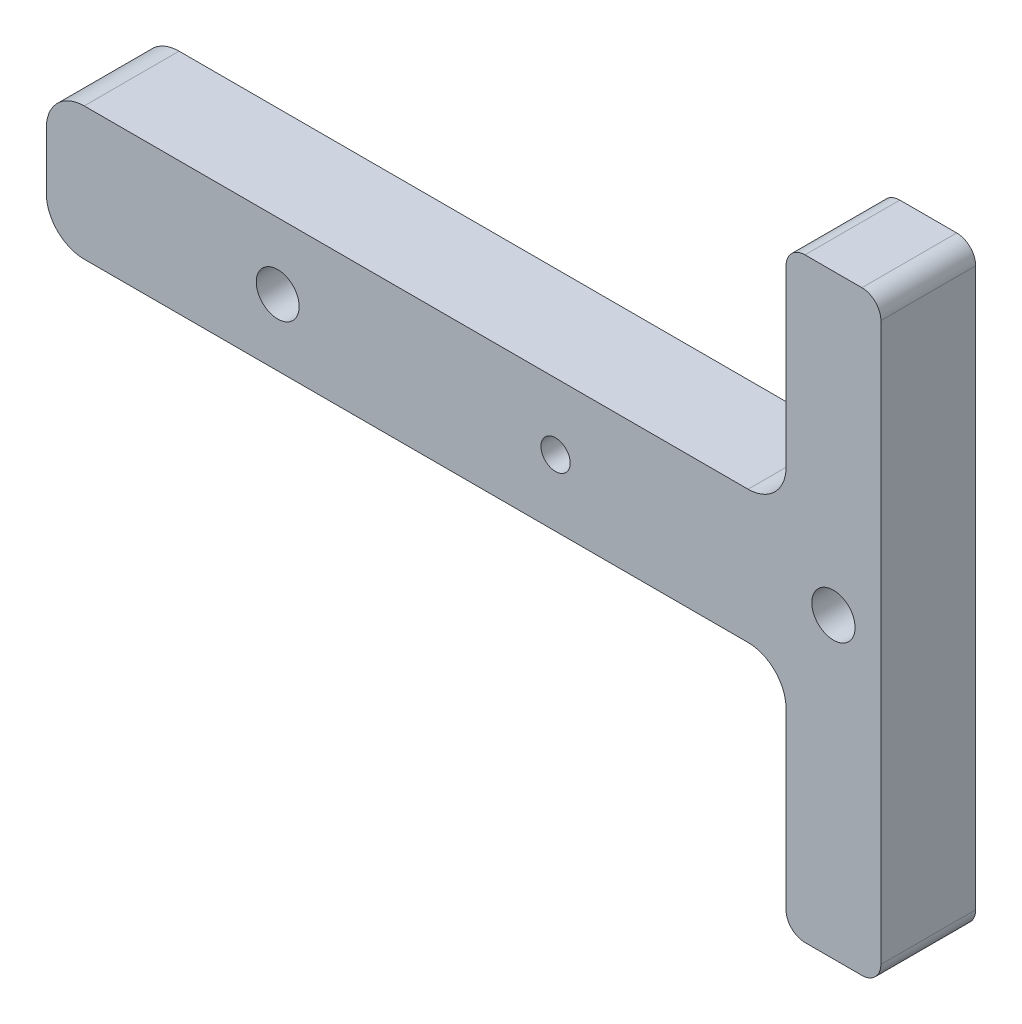
ISO-10303-21;
HEADER;
FILE_DESCRIPTION(('STEP AP214'),'2;1');
FILE_NAME('part.step','',(''),(''),'','','');
FILE_SCHEMA(('AUTOMOTIVE_DESIGN { 1 0 10303 214 1 1 1 1 }'));
ENDSEC;
DATA;
#1=APPLICATION_CONTEXT('core data for automotive mechanical design processes');
#2=APPLICATION_PROTOCOL_DEFINITION('international standard','automotive_design',2000,#1);
#3=PRODUCT_CONTEXT('',#1,'mechanical');
#4=PRODUCT('Part','Part','',(#3));
#5=PRODUCT_RELATED_PRODUCT_CATEGORY('part','',(#4));
#6=PRODUCT_DEFINITION_FORMATION('','',#4);
#7=PRODUCT_DEFINITION_CONTEXT('part definition',#1,'design');
#8=PRODUCT_DEFINITION('design','',#6,#7);
#9=PRODUCT_DEFINITION_SHAPE('','',#8);
#10=(LENGTH_UNIT() NAMED_UNIT(*) SI_UNIT(.MILLI.,.METRE.));
#11=(NAMED_UNIT(*) PLANE_ANGLE_UNIT() SI_UNIT($,.RADIAN.));
#12=(NAMED_UNIT(*) SI_UNIT($,.STERADIAN.) SOLID_ANGLE_UNIT());
#13=UNCERTAINTY_MEASURE_WITH_UNIT(LENGTH_MEASURE(1.E-05),#10,'distance_accuracy_value','');
#14=(GEOMETRIC_REPRESENTATION_CONTEXT(3) GLOBAL_UNCERTAINTY_ASSIGNED_CONTEXT((#13)) GLOBAL_UNIT_ASSIGNED_CONTEXT((#10,
#11,#12)) REPRESENTATION_CONTEXT('',''));
#15=CARTESIAN_POINT('',(0.,0.,0.));
#16=DIRECTION('',(0.,0.,1.));
#17=DIRECTION('',(1.,0.,0.));
#18=AXIS2_PLACEMENT_3D('',#15,#16,#17);
#19=CARTESIAN_POINT('',(17.5,2.,5.));
#20=DIRECTION('',(0.,0.,-1.));
#21=DIRECTION('',(-1.,0.,0.));
#22=AXIS2_PLACEMENT_3D('',#19,#20,#21);
#23=CYLINDRICAL_SURFACE('',#22,2.);
#24=CARTESIAN_POINT('',(17.5,2.,0.));
#25=DIRECTION('',(0.,0.,-1.));
#26=DIRECTION('',(1.,0.,0.));
#27=AXIS2_PLACEMENT_3D('',#24,#25,#26);
#28=CIRCLE('',#27,2.);
#29=CARTESIAN_POINT('',(19.5,2.00000000000001,0.));
#30=VERTEX_POINT('',#29);
#31=CARTESIAN_POINT('',(17.5,0.,0.));
#32=VERTEX_POINT('',#31);
#33=EDGE_CURVE('E196',#30,#32,#28,.T.);
#34=ORIENTED_EDGE('',*,*,#33,.T.);
#35=DIRECTION('',(0.,0.,-1.));
#36=VECTOR('',#35,1.);
#37=CARTESIAN_POINT('',(17.5,0.,5.));
#38=LINE('',#37,#36);
#39=CARTESIAN_POINT('',(17.5,0.,5.));
#40=VERTEX_POINT('',#39);
#41=EDGE_CURVE('E11',#40,#32,#38,.T.);
#42=ORIENTED_EDGE('',*,*,#41,.F.);
#43=CARTESIAN_POINT('',(17.5,2.,5.));
#44=DIRECTION('',(0.,0.,-1.));
#45=DIRECTION('',(1.,0.,0.));
#46=AXIS2_PLACEMENT_3D('',#43,#44,#45);
#47=CIRCLE('',#46,2.);
#48=CARTESIAN_POINT('',(19.5,2.00000000000001,5.));
#49=VERTEX_POINT('',#48);
#50=EDGE_CURVE('E242',#49,#40,#47,.T.);
#51=ORIENTED_EDGE('',*,*,#50,.F.);
#52=DIRECTION('',(0.,0.,-1.));
#53=VECTOR('',#52,1.);
#54=CARTESIAN_POINT('',(19.5,2.00000000000001,5.));
#55=LINE('',#54,#53);
#56=EDGE_CURVE('E192',#49,#30,#55,.T.);
#57=ORIENTED_EDGE('',*,*,#56,.T.);
#58=EDGE_LOOP('',(#34,#42,#51,#57));
#59=FACE_BOUND('',#58,.T.);
#60=ADVANCED_FACE('F45',(#59),#23,.F.);
#61=CARTESIAN_POINT('',(-17.5,0.,5.));
#62=DIRECTION('',(0.,-1.,0.));
#63=DIRECTION('',(0.,0.,-1.));
#64=AXIS2_PLACEMENT_3D('',#61,#62,#63);
#65=PLANE('',#64);
#66=DIRECTION('',(-1.,0.,0.));
#67=VECTOR('',#66,1.);
#68=CARTESIAN_POINT('',(-17.5,0.,0.));
#69=LINE('',#68,#67);
#70=CARTESIAN_POINT('',(-17.5,0.,0.));
#71=VERTEX_POINT('',#70);
#72=EDGE_CURVE('E200',#32,#71,#69,.T.);
#73=ORIENTED_EDGE('',*,*,#72,.T.);
#74=DIRECTION('',(0.,0.,-1.));
#75=VECTOR('',#74,1.);
#76=CARTESIAN_POINT('',(-17.5,0.,5.));
#77=LINE('',#76,#75);
#78=CARTESIAN_POINT('',(-17.5,0.,5.));
#79=VERTEX_POINT('',#78);
#80=EDGE_CURVE('E54',#79,#71,#77,.T.);
#81=ORIENTED_EDGE('',*,*,#80,.F.);
#82=DIRECTION('',(-1.,0.,0.));
#83=VECTOR('',#82,1.);
#84=CARTESIAN_POINT('',(-17.5,0.,5.));
#85=LINE('',#84,#83);
#86=EDGE_CURVE('E129',#40,#79,#85,.T.);
#87=ORIENTED_EDGE('',*,*,#86,.F.);
#88=ORIENTED_EDGE('',*,*,#41,.T.);
#89=EDGE_LOOP('',(#73,#81,#87,#88));
#90=FACE_BOUND('',#89,.T.);
#91=ADVANCED_FACE('F386',(#90),#65,.F.);
#92=CARTESIAN_POINT('',(-17.5,-2.,5.));
#93=DIRECTION('',(0.,0.,-1.));
#94=DIRECTION('',(-1.,0.,0.));
#95=AXIS2_PLACEMENT_3D('',#92,#93,#94);
#96=CYLINDRICAL_SURFACE('',#95,2.);
#97=CARTESIAN_POINT('',(-17.5,-2.,0.));
#98=DIRECTION('',(0.,0.,1.));
#99=DIRECTION('',(1.,0.,0.));
#100=AXIS2_PLACEMENT_3D('',#97,#98,#99);
#101=CIRCLE('',#100,2.);
#102=CARTESIAN_POINT('',(-19.5,-2.00000000000001,0.));
#103=VERTEX_POINT('',#102);
#104=EDGE_CURVE('E204',#71,#103,#101,.T.);
#105=ORIENTED_EDGE('',*,*,#104,.T.);
#106=DIRECTION('',(0.,0.,-1.));
#107=VECTOR('',#106,1.);
#108=CARTESIAN_POINT('',(-19.5,-2.00000000000001,5.));
#109=LINE('',#108,#107);
#110=CARTESIAN_POINT('',(-19.5,-2.00000000000001,5.));
#111=VERTEX_POINT('',#110);
#112=EDGE_CURVE('E285',#111,#103,#109,.T.);
#113=ORIENTED_EDGE('',*,*,#112,.F.);
#114=CARTESIAN_POINT('',(-17.5,-2.,5.));
#115=DIRECTION('',(0.,0.,1.));
#116=DIRECTION('',(1.,0.,0.));
#117=AXIS2_PLACEMENT_3D('',#114,#115,#116);
#118=CIRCLE('',#117,2.);
#119=EDGE_CURVE('E296',#79,#111,#118,.T.);
#120=ORIENTED_EDGE('',*,*,#119,.F.);
#121=ORIENTED_EDGE('',*,*,#80,.T.);
#122=EDGE_LOOP('',(#105,#113,#120,#121));
#123=FACE_BOUND('',#122,.T.);
#124=ADVANCED_FACE('F294',(#123),#96,.T.);
#125=CARTESIAN_POINT('',(-19.5,-2.00000000000001,5.));
#126=DIRECTION('',(1.,0.,0.));
#127=DIRECTION('',(0.,0.,-1.));
#128=AXIS2_PLACEMENT_3D('',#125,#126,#127);
#129=PLANE('',#128);
#130=DIRECTION('',(0.,-1.,0.));
#131=VECTOR('',#130,1.);
#132=CARTESIAN_POINT('',(-19.5,-2.00000000000001,0.));
#133=LINE('',#132,#131);
#134=CARTESIAN_POINT('',(-19.5,-4.99999999999999,0.));
#135=VERTEX_POINT('',#134);
#136=EDGE_CURVE('E206',#103,#135,#133,.T.);
#137=ORIENTED_EDGE('',*,*,#136,.T.);
#138=DIRECTION('',(0.,0.,-1.));
#139=VECTOR('',#138,1.);
#140=CARTESIAN_POINT('',(-19.5,-4.99999999999999,5.));
#141=LINE('',#140,#139);
#142=CARTESIAN_POINT('',(-19.5,-4.99999999999999,5.));
#143=VERTEX_POINT('',#142);
#144=EDGE_CURVE('E281',#143,#135,#141,.T.);
#145=ORIENTED_EDGE('',*,*,#144,.F.);
#146=DIRECTION('',(0.,-1.,0.));
#147=VECTOR('',#146,1.);
#148=CARTESIAN_POINT('',(-19.5,-2.00000000000001,5.));
#149=LINE('',#148,#147);
#150=EDGE_CURVE('E314',#111,#143,#149,.T.);
#151=ORIENTED_EDGE('',*,*,#150,.F.);
#152=ORIENTED_EDGE('',*,*,#112,.T.);
#153=EDGE_LOOP('',(#137,#145,#151,#152));
#154=FACE_BOUND('',#153,.T.);
#155=ADVANCED_FACE('F305',(#154),#129,.F.);
#156=CARTESIAN_POINT('',(-17.5,-5.,5.));
#157=DIRECTION('',(0.,0.,-1.));
#158=DIRECTION('',(-1.,0.,0.));
#159=AXIS2_PLACEMENT_3D('',#156,#157,#158);
#160=CYLINDRICAL_SURFACE('',#159,2.);
#161=CARTESIAN_POINT('',(-17.5,-5.,0.));
#162=DIRECTION('',(0.,0.,1.));
#163=DIRECTION('',(-1.,0.,0.));
#164=AXIS2_PLACEMENT_3D('',#161,#162,#163);
#165=CIRCLE('',#164,2.);
#166=CARTESIAN_POINT('',(-17.5,-7.,0.));
#167=VERTEX_POINT('',#166);
#168=EDGE_CURVE('E209',#135,#167,#165,.T.);
#169=ORIENTED_EDGE('',*,*,#168,.T.);
#170=DIRECTION('',(0.,0.,-1.));
#171=VECTOR('',#170,1.);
#172=CARTESIAN_POINT('',(-17.5,-7.,5.));
#173=LINE('',#172,#171);
#174=CARTESIAN_POINT('',(-17.5,-7.,5.));
#175=VERTEX_POINT('',#174);
#176=EDGE_CURVE('E277',#175,#167,#173,.T.);
#177=ORIENTED_EDGE('',*,*,#176,.F.);
#178=CARTESIAN_POINT('',(-17.5,-5.,5.));
#179=DIRECTION('',(0.,0.,1.));
#180=DIRECTION('',(-1.,0.,0.));
#181=AXIS2_PLACEMENT_3D('',#178,#179,#180);
#182=CIRCLE('',#181,2.);
#183=EDGE_CURVE('E311',#143,#175,#182,.T.);
#184=ORIENTED_EDGE('',*,*,#183,.F.);
#185=ORIENTED_EDGE('',*,*,#144,.T.);
#186=EDGE_LOOP('',(#169,#177,#184,#185));
#187=FACE_BOUND('',#186,.T.);
#188=ADVANCED_FACE('F309',(#187),#160,.T.);
#189=CARTESIAN_POINT('',(-17.5,-7.,5.));
#190=DIRECTION('',(0.,1.,0.));
#191=DIRECTION('',(0.,0.,1.));
#192=AXIS2_PLACEMENT_3D('',#189,#190,#191);
#193=PLANE('',#192);
#194=DIRECTION('',(1.,0.,0.));
#195=VECTOR('',#194,1.);
#196=CARTESIAN_POINT('',(-17.5,-7.,0.));
#197=LINE('',#196,#195);
#198=CARTESIAN_POINT('',(17.5,-7.,0.));
#199=VERTEX_POINT('',#198);
#200=EDGE_CURVE('E212',#167,#199,#197,.T.);
#201=ORIENTED_EDGE('',*,*,#200,.T.);
#202=DIRECTION('',(0.,0.,-1.));
#203=VECTOR('',#202,1.);
#204=CARTESIAN_POINT('',(17.5,-7.,5.));
#205=LINE('',#204,#203);
#206=CARTESIAN_POINT('',(17.5,-7.,5.));
#207=VERTEX_POINT('',#206);
#208=EDGE_CURVE('E273',#207,#199,#205,.T.);
#209=ORIENTED_EDGE('',*,*,#208,.F.);
#210=DIRECTION('',(1.,0.,0.));
#211=VECTOR('',#210,1.);
#212=CARTESIAN_POINT('',(-17.5,-7.,5.));
#213=LINE('',#212,#211);
#214=EDGE_CURVE('E313',#175,#207,#213,.T.);
#215=ORIENTED_EDGE('',*,*,#214,.F.);
#216=ORIENTED_EDGE('',*,*,#176,.T.);
#217=EDGE_LOOP('',(#201,#209,#215,#216));
#218=FACE_BOUND('',#217,.T.);
#219=ADVANCED_FACE('F426',(#218),#193,.F.);
#220=CARTESIAN_POINT('',(17.5,-9.,5.));
#221=DIRECTION('',(0.,0.,-1.));
#222=DIRECTION('',(-1.,0.,0.));
#223=AXIS2_PLACEMENT_3D('',#220,#221,#222);
#224=CYLINDRICAL_SURFACE('',#223,2.);
#225=CARTESIAN_POINT('',(17.5,-9.,0.));
#226=DIRECTION('',(0.,0.,-1.));
#227=DIRECTION('',(-1.,0.,0.));
#228=AXIS2_PLACEMENT_3D('',#225,#226,#227);
#229=CIRCLE('',#228,2.);
#230=CARTESIAN_POINT('',(19.5,-9.00000000000001,0.));
#231=VERTEX_POINT('',#230);
#232=EDGE_CURVE('E215',#199,#231,#229,.T.);
#233=ORIENTED_EDGE('',*,*,#232,.T.);
#234=DIRECTION('',(0.,0.,-1.));
#235=VECTOR('',#234,1.);
#236=CARTESIAN_POINT('',(19.5,-9.00000000000001,5.));
#237=LINE('',#236,#235);
#238=CARTESIAN_POINT('',(19.5,-9.00000000000001,5.));
#239=VERTEX_POINT('',#238);
#240=EDGE_CURVE('E269',#239,#231,#237,.T.);
#241=ORIENTED_EDGE('',*,*,#240,.F.);
#242=CARTESIAN_POINT('',(17.5,-9.,5.));
#243=DIRECTION('',(0.,0.,-1.));
#244=DIRECTION('',(-1.,0.,0.));
#245=AXIS2_PLACEMENT_3D('',#242,#243,#244);
#246=CIRCLE('',#245,2.);
#247=EDGE_CURVE('E317',#207,#239,#246,.T.);
#248=ORIENTED_EDGE('',*,*,#247,.F.);
#249=ORIENTED_EDGE('',*,*,#208,.T.);
#250=EDGE_LOOP('',(#233,#241,#248,#249));
#251=FACE_BOUND('',#250,.T.);
#252=ADVANCED_FACE('F422',(#251),#224,.F.);
#253=CARTESIAN_POINT('',(19.5,-9.00000000000001,5.));
#254=DIRECTION('',(1.,0.,0.));
#255=DIRECTION('',(0.,0.,-1.));
#256=AXIS2_PLACEMENT_3D('',#253,#254,#255);
#257=PLANE('',#256);
#258=DIRECTION('',(0.,-1.,0.));
#259=VECTOR('',#258,1.);
#260=CARTESIAN_POINT('',(19.5,-9.00000000000001,0.));
#261=LINE('',#260,#259);
#262=CARTESIAN_POINT('',(19.5,-18.2,0.));
#263=VERTEX_POINT('',#262);
#264=EDGE_CURVE('E218',#231,#263,#261,.T.);
#265=ORIENTED_EDGE('',*,*,#264,.T.);
#266=DIRECTION('',(0.,0.,-1.));
#267=VECTOR('',#266,1.);
#268=CARTESIAN_POINT('',(19.5,-18.2,5.));
#269=LINE('',#268,#267);
#270=CARTESIAN_POINT('',(19.5,-18.2,5.));
#271=VERTEX_POINT('',#270);
#272=EDGE_CURVE('E265',#271,#263,#269,.T.);
#273=ORIENTED_EDGE('',*,*,#272,.F.);
#274=DIRECTION('',(0.,-1.,0.));
#275=VECTOR('',#274,1.);
#276=CARTESIAN_POINT('',(19.5,-9.00000000000001,5.));
#277=LINE('',#276,#275);
#278=EDGE_CURVE('E325',#239,#271,#277,.T.);
#279=ORIENTED_EDGE('',*,*,#278,.F.);
#280=ORIENTED_EDGE('',*,*,#240,.T.);
#281=EDGE_LOOP('',(#265,#273,#279,#280));
#282=FACE_BOUND('',#281,.T.);
#283=ADVANCED_FACE('F418',(#282),#257,.F.);
#284=CARTESIAN_POINT('',(20.5,-18.2,5.));
#285=DIRECTION('',(0.,0.,-1.));
#286=DIRECTION('',(-1.,0.,0.));
#287=AXIS2_PLACEMENT_3D('',#284,#285,#286);
#288=CYLINDRICAL_SURFACE('',#287,1.);
#289=CARTESIAN_POINT('',(20.5,-18.2,0.));
#290=DIRECTION('',(0.,0.,1.));
#291=DIRECTION('',(1.,0.,0.));
#292=AXIS2_PLACEMENT_3D('',#289,#290,#291);
#293=CIRCLE('',#292,1.);
#294=CARTESIAN_POINT('',(20.5,-19.2,0.));
#295=VERTEX_POINT('',#294);
#296=EDGE_CURVE('E221',#263,#295,#293,.T.);
#297=ORIENTED_EDGE('',*,*,#296,.T.);
#298=DIRECTION('',(0.,0.,-1.));
#299=VECTOR('',#298,1.);
#300=CARTESIAN_POINT('',(20.5,-19.2,5.));
#301=LINE('',#300,#299);
#302=CARTESIAN_POINT('',(20.5,-19.2,5.));
#303=VERTEX_POINT('',#302);
#304=EDGE_CURVE('E261',#303,#295,#301,.T.);
#305=ORIENTED_EDGE('',*,*,#304,.F.);
#306=CARTESIAN_POINT('',(20.5,-18.2,5.));
#307=DIRECTION('',(0.,0.,1.));
#308=DIRECTION('',(1.,0.,0.));
#309=AXIS2_PLACEMENT_3D('',#306,#307,#308);
#310=CIRCLE('',#309,1.);
#311=EDGE_CURVE('E328',#271,#303,#310,.T.);
#312=ORIENTED_EDGE('',*,*,#311,.F.);
#313=ORIENTED_EDGE('',*,*,#272,.T.);
#314=EDGE_LOOP('',(#297,#305,#312,#313));
#315=FACE_BOUND('',#314,.T.);
#316=ADVANCED_FACE('F414',(#315),#288,.T.);
#317=CARTESIAN_POINT('',(20.5,-19.2,5.));
#318=DIRECTION('',(0.,1.,0.));
#319=DIRECTION('',(0.,0.,1.));
#320=AXIS2_PLACEMENT_3D('',#317,#318,#319);
#321=PLANE('',#320);
#322=DIRECTION('',(1.,0.,0.));
#323=VECTOR('',#322,1.);
#324=CARTESIAN_POINT('',(20.5,-19.2,0.));
#325=LINE('',#324,#323);
#326=CARTESIAN_POINT('',(23.5,-19.2,0.));
#327=VERTEX_POINT('',#326);
#328=EDGE_CURVE('E224',#295,#327,#325,.T.);
#329=ORIENTED_EDGE('',*,*,#328,.T.);
#330=DIRECTION('',(0.,0.,-1.));
#331=VECTOR('',#330,1.);
#332=CARTESIAN_POINT('',(23.5,-19.2,5.));
#333=LINE('',#332,#331);
#334=CARTESIAN_POINT('',(23.5,-19.2,5.));
#335=VERTEX_POINT('',#334);
#336=EDGE_CURVE('E257',#335,#327,#333,.T.);
#337=ORIENTED_EDGE('',*,*,#336,.F.);
#338=DIRECTION('',(1.,0.,0.));
#339=VECTOR('',#338,1.);
#340=CARTESIAN_POINT('',(20.5,-19.2,5.));
#341=LINE('',#340,#339);
#342=EDGE_CURVE('E331',#303,#335,#341,.T.);
#343=ORIENTED_EDGE('',*,*,#342,.F.);
#344=ORIENTED_EDGE('',*,*,#304,.T.);
#345=EDGE_LOOP('',(#329,#337,#343,#344));
#346=FACE_BOUND('',#345,.T.);
#347=ADVANCED_FACE('F409',(#346),#321,.F.);
#348=CARTESIAN_POINT('',(23.5,-18.2,5.));
#349=DIRECTION('',(0.,0.,-1.));
#350=DIRECTION('',(-1.,0.,0.));
#351=AXIS2_PLACEMENT_3D('',#348,#349,#350);
#352=CYLINDRICAL_SURFACE('',#351,1.);
#353=CARTESIAN_POINT('',(23.5,-18.2,0.));
#354=DIRECTION('',(0.,0.,1.));
#355=DIRECTION('',(1.,0.,0.));
#356=AXIS2_PLACEMENT_3D('',#353,#354,#355);
#357=CIRCLE('',#356,1.);
#358=CARTESIAN_POINT('',(24.5,-18.2,0.));
#359=VERTEX_POINT('',#358);
#360=EDGE_CURVE('E227',#327,#359,#357,.T.);
#361=ORIENTED_EDGE('',*,*,#360,.T.);
#362=DIRECTION('',(0.,0.,-1.));
#363=VECTOR('',#362,1.);
#364=CARTESIAN_POINT('',(24.5,-18.2,5.));
#365=LINE('',#364,#363);
#366=CARTESIAN_POINT('',(24.5,-18.2,5.));
#367=VERTEX_POINT('',#366);
#368=EDGE_CURVE('E253',#367,#359,#365,.T.);
#369=ORIENTED_EDGE('',*,*,#368,.F.);
#370=CARTESIAN_POINT('',(23.5,-18.2,5.));
#371=DIRECTION('',(0.,0.,1.));
#372=DIRECTION('',(1.,0.,0.));
#373=AXIS2_PLACEMENT_3D('',#370,#371,#372);
#374=CIRCLE('',#373,1.);
#375=EDGE_CURVE('E334',#335,#367,#374,.T.);
#376=ORIENTED_EDGE('',*,*,#375,.F.);
#377=ORIENTED_EDGE('',*,*,#336,.T.);
#378=EDGE_LOOP('',(#361,#369,#376,#377));
#379=FACE_BOUND('',#378,.T.);
#380=ADVANCED_FACE('F403',(#379),#352,.T.);
#381=CARTESIAN_POINT('',(24.5,11.2,5.));
#382=DIRECTION('',(-1.,0.,0.));
#383=DIRECTION('',(0.,0.,1.));
#384=AXIS2_PLACEMENT_3D('',#381,#382,#383);
#385=PLANE('',#384);
#386=DIRECTION('',(0.,1.,0.));
#387=VECTOR('',#386,1.);
#388=CARTESIAN_POINT('',(24.5,11.2,0.));
#389=LINE('',#388,#387);
#390=CARTESIAN_POINT('',(24.5,11.2,0.));
#391=VERTEX_POINT('',#390);
#392=EDGE_CURVE('E230',#359,#391,#389,.T.);
#393=ORIENTED_EDGE('',*,*,#392,.T.);
#394=DIRECTION('',(0.,0.,-1.));
#395=VECTOR('',#394,1.);
#396=CARTESIAN_POINT('',(24.5,11.2,5.));
#397=LINE('',#396,#395);
#398=CARTESIAN_POINT('',(24.5,11.2,5.));
#399=VERTEX_POINT('',#398);
#400=EDGE_CURVE('E249',#399,#391,#397,.T.);
#401=ORIENTED_EDGE('',*,*,#400,.F.);
#402=DIRECTION('',(0.,1.,0.));
#403=VECTOR('',#402,1.);
#404=CARTESIAN_POINT('',(24.5,11.2,5.));
#405=LINE('',#404,#403);
#406=EDGE_CURVE('E337',#367,#399,#405,.T.);
#407=ORIENTED_EDGE('',*,*,#406,.F.);
#408=ORIENTED_EDGE('',*,*,#368,.T.);
#409=EDGE_LOOP('',(#393,#401,#407,#408));
#410=FACE_BOUND('',#409,.T.);
#411=ADVANCED_FACE('F399',(#410),#385,.F.);
#412=CARTESIAN_POINT('',(23.5,11.2,5.));
#413=DIRECTION('',(0.,0.,-1.));
#414=DIRECTION('',(-1.,0.,0.));
#415=AXIS2_PLACEMENT_3D('',#412,#413,#414);
#416=CYLINDRICAL_SURFACE('',#415,1.);
#417=CARTESIAN_POINT('',(23.5,11.2,0.));
#418=DIRECTION('',(0.,0.,1.));
#419=DIRECTION('',(-1.,0.,0.));
#420=AXIS2_PLACEMENT_3D('',#417,#418,#419);
#421=CIRCLE('',#420,1.);
#422=CARTESIAN_POINT('',(23.5,12.2,0.));
#423=VERTEX_POINT('',#422);
#424=EDGE_CURVE('E233',#391,#423,#421,.T.);
#425=ORIENTED_EDGE('',*,*,#424,.T.);
#426=DIRECTION('',(0.,0.,-1.));
#427=VECTOR('',#426,1.);
#428=CARTESIAN_POINT('',(23.5,12.2,5.));
#429=LINE('',#428,#427);
#430=CARTESIAN_POINT('',(23.5,12.2,5.));
#431=VERTEX_POINT('',#430);
#432=EDGE_CURVE('E183',#431,#423,#429,.T.);
#433=ORIENTED_EDGE('',*,*,#432,.F.);
#434=CARTESIAN_POINT('',(23.5,11.2,5.));
#435=DIRECTION('',(0.,0.,1.));
#436=DIRECTION('',(-1.,0.,0.));
#437=AXIS2_PLACEMENT_3D('',#434,#435,#436);
#438=CIRCLE('',#437,1.);
#439=EDGE_CURVE('E172',#399,#431,#438,.T.);
#440=ORIENTED_EDGE('',*,*,#439,.F.);
#441=ORIENTED_EDGE('',*,*,#400,.T.);
#442=EDGE_LOOP('',(#425,#433,#440,#441));
#443=FACE_BOUND('',#442,.T.);
#444=ADVANCED_FACE('F395',(#443),#416,.T.);
#445=CARTESIAN_POINT('',(20.5,12.2,5.));
#446=DIRECTION('',(0.,-1.,0.));
#447=DIRECTION('',(0.,0.,-1.));
#448=AXIS2_PLACEMENT_3D('',#445,#446,#447);
#449=PLANE('',#448);
#450=DIRECTION('',(-1.,0.,0.));
#451=VECTOR('',#450,1.);
#452=CARTESIAN_POINT('',(20.5,12.2,0.));
#453=LINE('',#452,#451);
#454=CARTESIAN_POINT('',(20.5,12.2,0.));
#455=VERTEX_POINT('',#454);
#456=EDGE_CURVE('E181',#423,#455,#453,.T.);
#457=ORIENTED_EDGE('',*,*,#456,.T.);
#458=DIRECTION('',(0.,0.,-1.));
#459=VECTOR('',#458,1.);
#460=CARTESIAN_POINT('',(20.5,12.2,5.));
#461=LINE('',#460,#459);
#462=CARTESIAN_POINT('',(20.5,12.2,5.));
#463=VERTEX_POINT('',#462);
#464=EDGE_CURVE('E178',#463,#455,#461,.T.);
#465=ORIENTED_EDGE('',*,*,#464,.F.);
#466=DIRECTION('',(-1.,0.,0.));
#467=VECTOR('',#466,1.);
#468=CARTESIAN_POINT('',(20.5,12.2,5.));
#469=LINE('',#468,#467);
#470=EDGE_CURVE('E166',#431,#463,#469,.T.);
#471=ORIENTED_EDGE('',*,*,#470,.F.);
#472=ORIENTED_EDGE('',*,*,#432,.T.);
#473=EDGE_LOOP('',(#457,#465,#471,#472));
#474=FACE_BOUND('',#473,.T.);
#475=ADVANCED_FACE('F179',(#474),#449,.F.);
#476=CARTESIAN_POINT('',(20.5,11.2,5.));
#477=DIRECTION('',(0.,0.,-1.));
#478=DIRECTION('',(-1.,0.,0.));
#479=AXIS2_PLACEMENT_3D('',#476,#477,#478);
#480=CYLINDRICAL_SURFACE('',#479,1.);
#481=CARTESIAN_POINT('',(20.5,11.2,0.));
#482=DIRECTION('',(0.,0.,1.));
#483=DIRECTION('',(-1.,0.,0.));
#484=AXIS2_PLACEMENT_3D('',#481,#482,#483);
#485=CIRCLE('',#484,1.);
#486=CARTESIAN_POINT('',(19.5,11.2,0.));
#487=VERTEX_POINT('',#486);
#488=EDGE_CURVE('E115',#455,#487,#485,.T.);
#489=ORIENTED_EDGE('',*,*,#488,.T.);
#490=DIRECTION('',(0.,0.,-1.));
#491=VECTOR('',#490,1.);
#492=CARTESIAN_POINT('',(19.5,11.2,5.));
#493=LINE('',#492,#491);
#494=CARTESIAN_POINT('',(19.5,11.2,5.));
#495=VERTEX_POINT('',#494);
#496=EDGE_CURVE('E184',#495,#487,#493,.T.);
#497=ORIENTED_EDGE('',*,*,#496,.F.);
#498=CARTESIAN_POINT('',(20.5,11.2,5.));
#499=DIRECTION('',(0.,0.,1.));
#500=DIRECTION('',(-1.,0.,0.));
#501=AXIS2_PLACEMENT_3D('',#498,#499,#500);
#502=CIRCLE('',#501,1.);
#503=EDGE_CURVE('E170',#463,#495,#502,.T.);
#504=ORIENTED_EDGE('',*,*,#503,.F.);
#505=ORIENTED_EDGE('',*,*,#464,.T.);
#506=EDGE_LOOP('',(#489,#497,#504,#505));
#507=FACE_BOUND('',#506,.T.);
#508=ADVANCED_FACE('F186',(#507),#480,.T.);
#509=CARTESIAN_POINT('',(19.5,2.00000000000001,5.));
#510=DIRECTION('',(1.,0.,0.));
#511=DIRECTION('',(0.,0.,-1.));
#512=AXIS2_PLACEMENT_3D('',#509,#510,#511);
#513=PLANE('',#512);
#514=DIRECTION('',(0.,-1.,0.));
#515=VECTOR('',#514,1.);
#516=CARTESIAN_POINT('',(19.5,2.00000000000001,0.));
#517=LINE('',#516,#515);
#518=EDGE_CURVE('E121',#487,#30,#517,.T.);
#519=ORIENTED_EDGE('',*,*,#518,.T.);
#520=ORIENTED_EDGE('',*,*,#56,.F.);
#521=DIRECTION('',(0.,-1.,0.));
#522=VECTOR('',#521,1.);
#523=CARTESIAN_POINT('',(19.5,2.00000000000001,5.));
#524=LINE('',#523,#522);
#525=EDGE_CURVE('E62',#495,#49,#524,.T.);
#526=ORIENTED_EDGE('',*,*,#525,.F.);
#527=ORIENTED_EDGE('',*,*,#496,.T.);
#528=EDGE_LOOP('',(#519,#520,#526,#527));
#529=FACE_BOUND('',#528,.T.);
#530=ADVANCED_FACE('F372',(#529),#513,.F.);
#531=CARTESIAN_POINT('',(17.5,2.,5.));
#532=DIRECTION('',(0.,0.,1.));
#533=DIRECTION('',(1.,0.,0.));
#534=AXIS2_PLACEMENT_3D('',#531,#532,#533);
#535=PLANE('',#534);
#536=CARTESIAN_POINT('',(7.35,-3.5,5.));
#537=DIRECTION('',(0.,0.,1.));
#538=DIRECTION('',(1.,0.,0.));
#539=AXIS2_PLACEMENT_3D('',#536,#537,#538);
#540=CIRCLE('',#539,0.77);
#541=CARTESIAN_POINT('',(8.12,-3.5,5.));
#542=VERTEX_POINT('',#541);
#543=EDGE_CURVE('E363',#542,#542,#540,.T.);
#544=ORIENTED_EDGE('',*,*,#543,.F.);
#545=EDGE_LOOP('',(#544));
#546=FACE_BOUND('',#545,.T.);
#547=CARTESIAN_POINT('',(22.,-3.5,5.));
#548=DIRECTION('',(0.,0.,1.));
#549=DIRECTION('',(1.,0.,0.));
#550=AXIS2_PLACEMENT_3D('',#547,#548,#549);
#551=CIRCLE('',#550,1.14098376285754);
#552=CARTESIAN_POINT('',(23.1409837628575,-3.5,5.));
#553=VERTEX_POINT('',#552);
#554=EDGE_CURVE('E355',#553,#553,#551,.T.);
#555=ORIENTED_EDGE('',*,*,#554,.F.);
#556=EDGE_LOOP('',(#555));
#557=FACE_BOUND('',#556,.T.);
#558=CARTESIAN_POINT('',(-7.3,-3.5,5.));
#559=DIRECTION('',(0.,0.,1.));
#560=DIRECTION('',(1.,0.,0.));
#561=AXIS2_PLACEMENT_3D('',#558,#559,#560);
#562=CIRCLE('',#561,1.13019452660028);
#563=CARTESIAN_POINT('',(-6.16980547339972,-3.5,5.));
#564=VERTEX_POINT('',#563);
#565=EDGE_CURVE('E351',#564,#564,#562,.T.);
#566=ORIENTED_EDGE('',*,*,#565,.F.);
#567=EDGE_LOOP('',(#566));
#568=FACE_BOUND('',#567,.T.);
#569=ORIENTED_EDGE('',*,*,#50,.T.);
#570=ORIENTED_EDGE('',*,*,#86,.T.);
#571=ORIENTED_EDGE('',*,*,#119,.T.);
#572=ORIENTED_EDGE('',*,*,#150,.T.);
#573=ORIENTED_EDGE('',*,*,#183,.T.);
#574=ORIENTED_EDGE('',*,*,#214,.T.);
#575=ORIENTED_EDGE('',*,*,#247,.T.);
#576=ORIENTED_EDGE('',*,*,#278,.T.);
#577=ORIENTED_EDGE('',*,*,#311,.T.);
#578=ORIENTED_EDGE('',*,*,#342,.T.);
#579=ORIENTED_EDGE('',*,*,#375,.T.);
#580=ORIENTED_EDGE('',*,*,#406,.T.);
#581=ORIENTED_EDGE('',*,*,#439,.T.);
#582=ORIENTED_EDGE('',*,*,#470,.T.);
#583=ORIENTED_EDGE('',*,*,#503,.T.);
#584=ORIENTED_EDGE('',*,*,#525,.T.);
#585=EDGE_LOOP('',(#569,#570,#571,#572,#573,#574,#575,#576,#577,#578,#579,#580,#581,#582,#583,#584));
#586=FACE_BOUND('',#585,.T.);
#587=ADVANCED_FACE('F168',(#546,#557,#568,#586),#535,.T.);
#588=CARTESIAN_POINT('',(17.5,2.,0.));
#589=DIRECTION('',(0.,0.,1.));
#590=DIRECTION('',(1.,0.,0.));
#591=AXIS2_PLACEMENT_3D('',#588,#589,#590);
#592=PLANE('',#591);
#593=CARTESIAN_POINT('',(22.,-3.5,0.));
#594=DIRECTION('',(0.,0.,1.));
#595=DIRECTION('',(1.,0.,0.));
#596=AXIS2_PLACEMENT_3D('',#593,#594,#595);
#597=CIRCLE('',#596,1.14098376285754);
#598=CARTESIAN_POINT('',(23.1409837628575,-3.5,0.));
#599=VERTEX_POINT('',#598);
#600=EDGE_CURVE('E201',#599,#599,#597,.T.);
#601=ORIENTED_EDGE('',*,*,#600,.T.);
#602=EDGE_LOOP('',(#601));
#603=FACE_BOUND('',#602,.T.);
#604=CARTESIAN_POINT('',(-7.3,-3.5,0.));
#605=DIRECTION('',(0.,0.,1.));
#606=DIRECTION('',(1.,0.,0.));
#607=AXIS2_PLACEMENT_3D('',#604,#605,#606);
#608=CIRCLE('',#607,1.13019452660028);
#609=CARTESIAN_POINT('',(-6.16980547339972,-3.5,0.));
#610=VERTEX_POINT('',#609);
#611=EDGE_CURVE('E346',#610,#610,#608,.T.);
#612=ORIENTED_EDGE('',*,*,#611,.T.);
#613=EDGE_LOOP('',(#612));
#614=FACE_BOUND('',#613,.T.);
#615=ORIENTED_EDGE('',*,*,#33,.F.);
#616=ORIENTED_EDGE('',*,*,#518,.F.);
#617=ORIENTED_EDGE('',*,*,#488,.F.);
#618=ORIENTED_EDGE('',*,*,#456,.F.);
#619=ORIENTED_EDGE('',*,*,#424,.F.);
#620=ORIENTED_EDGE('',*,*,#392,.F.);
#621=ORIENTED_EDGE('',*,*,#360,.F.);
#622=ORIENTED_EDGE('',*,*,#328,.F.);
#623=ORIENTED_EDGE('',*,*,#296,.F.);
#624=ORIENTED_EDGE('',*,*,#264,.F.);
#625=ORIENTED_EDGE('',*,*,#232,.F.);
#626=ORIENTED_EDGE('',*,*,#200,.F.);
#627=ORIENTED_EDGE('',*,*,#168,.F.);
#628=ORIENTED_EDGE('',*,*,#136,.F.);
#629=ORIENTED_EDGE('',*,*,#104,.F.);
#630=ORIENTED_EDGE('',*,*,#72,.F.);
#631=EDGE_LOOP('',(#615,#616,#617,#618,#619,#620,#621,#622,#623,#624,#625,#626,#627,#628,#629,#630));
#632=FACE_BOUND('',#631,.T.);
#633=ADVANCED_FACE('F300',(#603,#614,#632),#592,.F.);
#634=CARTESIAN_POINT('',(-7.3,-3.5,0.));
#635=DIRECTION('',(0.,0.,1.));
#636=DIRECTION('',(1.,0.,0.));
#637=AXIS2_PLACEMENT_3D('',#634,#635,#636);
#638=CYLINDRICAL_SURFACE('',#637,1.13019452660028);
#639=ORIENTED_EDGE('',*,*,#611,.F.);
#640=EDGE_LOOP('',(#639));
#641=FACE_BOUND('',#640,.T.);
#642=ORIENTED_EDGE('',*,*,#565,.T.);
#643=EDGE_LOOP('',(#642));
#644=FACE_BOUND('',#643,.T.);
#645=ADVANCED_FACE('F369',(#641,#644),#638,.F.);
#646=CARTESIAN_POINT('',(22.,-3.5,0.));
#647=DIRECTION('',(0.,0.,1.));
#648=DIRECTION('',(1.,0.,0.));
#649=AXIS2_PLACEMENT_3D('',#646,#647,#648);
#650=CYLINDRICAL_SURFACE('',#649,1.14098376285754);
#651=ORIENTED_EDGE('',*,*,#600,.F.);
#652=EDGE_LOOP('',(#651));
#653=FACE_BOUND('',#652,.T.);
#654=ORIENTED_EDGE('',*,*,#554,.T.);
#655=EDGE_LOOP('',(#654));
#656=FACE_BOUND('',#655,.T.);
#657=ADVANCED_FACE('F537',(#653,#656),#650,.F.);
#658=CARTESIAN_POINT('',(7.35,-3.5,2.));
#659=DIRECTION('',(0.,0.,1.));
#660=DIRECTION('',(1.,0.,0.));
#661=AXIS2_PLACEMENT_3D('',#658,#659,#660);
#662=CYLINDRICAL_SURFACE('',#661,0.77);
#663=CARTESIAN_POINT('',(7.35,-3.5,2.));
#664=DIRECTION('',(0.,0.,1.));
#665=DIRECTION('',(1.,0.,0.));
#666=AXIS2_PLACEMENT_3D('',#663,#664,#665);
#667=CIRCLE('',#666,0.77);
#668=CARTESIAN_POINT('',(8.12,-3.5,2.));
#669=VERTEX_POINT('',#668);
#670=EDGE_CURVE('E352',#669,#669,#667,.T.);
#671=ORIENTED_EDGE('',*,*,#670,.F.);
#672=EDGE_LOOP('',(#671));
#673=FACE_BOUND('',#672,.T.);
#674=ORIENTED_EDGE('',*,*,#543,.T.);
#675=EDGE_LOOP('',(#674));
#676=FACE_BOUND('',#675,.T.);
#677=ADVANCED_FACE('F544',(#673,#676),#662,.F.);
#678=CARTESIAN_POINT('',(7.35,-3.5,2.));
#679=DIRECTION('',(0.,0.,1.));
#680=DIRECTION('',(1.,0.,0.));
#681=AXIS2_PLACEMENT_3D('',#678,#679,#680);
#682=PLANE('',#681);
#683=ORIENTED_EDGE('',*,*,#670,.T.);
#684=EDGE_LOOP('',(#683));
#685=FACE_BOUND('',#684,.T.);
#686=ADVANCED_FACE('F554',(#685),#682,.T.);
#687=CLOSED_SHELL('',(#60,#91,#124,#155,#188,#219,#252,#283,#316,#347,#380,#411,#444,#475,#508,
#530,#587,#633,#645,#657,#677,#686));
#688=MANIFOLD_SOLID_BREP('B2',#687);
#689=ADVANCED_BREP_SHAPE_REPRESENTATION('',(#18,#688),#14);
#690=SHAPE_DEFINITION_REPRESENTATION(#9,#689);
ENDSEC;
END-ISO-10303-21;
